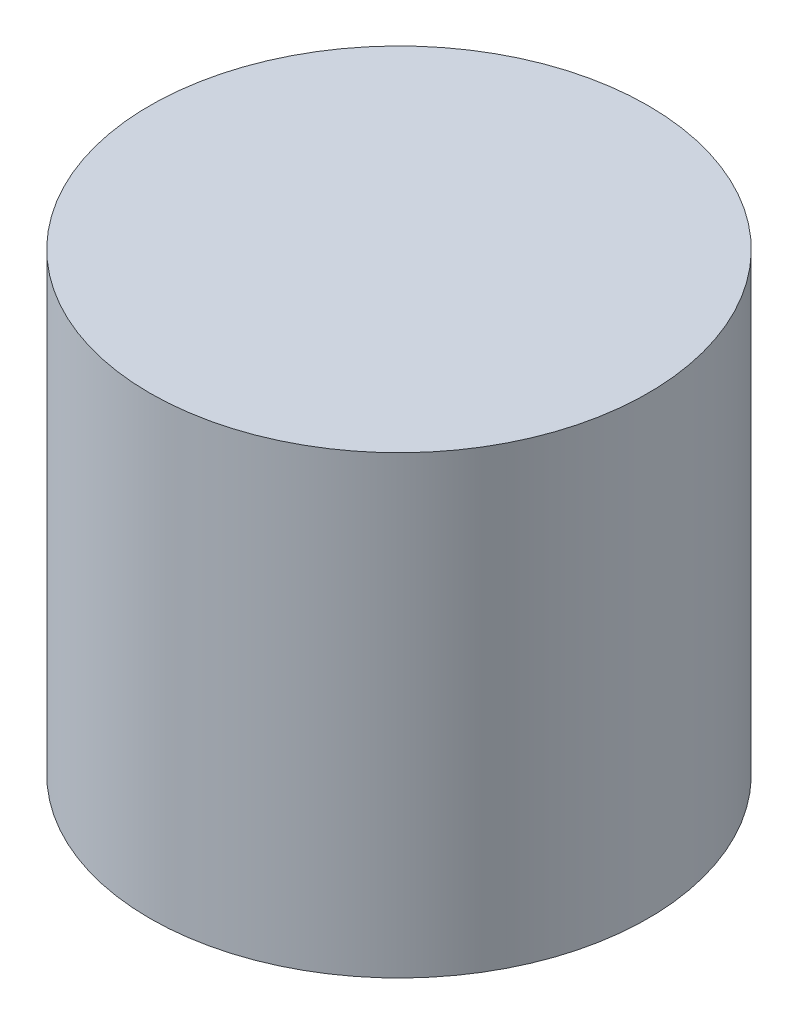
ISO-10303-21;
HEADER;
FILE_DESCRIPTION(('STEP AP214'),'2;1');
FILE_NAME('part.step','',(''),(''),'','','');
FILE_SCHEMA(('AUTOMOTIVE_DESIGN { 1 0 10303 214 1 1 1 1 }'));
ENDSEC;
DATA;
#1=APPLICATION_CONTEXT('core data for automotive mechanical design processes');
#2=APPLICATION_PROTOCOL_DEFINITION('international standard','automotive_design',2000,#1);
#3=PRODUCT_CONTEXT('',#1,'mechanical');
#4=PRODUCT('Part','Part','',(#3));
#5=PRODUCT_RELATED_PRODUCT_CATEGORY('part','',(#4));
#6=PRODUCT_DEFINITION_FORMATION('','',#4);
#7=PRODUCT_DEFINITION_CONTEXT('part definition',#1,'design');
#8=PRODUCT_DEFINITION('design','',#6,#7);
#9=PRODUCT_DEFINITION_SHAPE('','',#8);
#10=(LENGTH_UNIT() NAMED_UNIT(*) SI_UNIT(.MILLI.,.METRE.));
#11=(NAMED_UNIT(*) PLANE_ANGLE_UNIT() SI_UNIT($,.RADIAN.));
#12=(NAMED_UNIT(*) SI_UNIT($,.STERADIAN.) SOLID_ANGLE_UNIT());
#13=UNCERTAINTY_MEASURE_WITH_UNIT(LENGTH_MEASURE(1.E-05),#10,'distance_accuracy_value','');
#14=(GEOMETRIC_REPRESENTATION_CONTEXT(3) GLOBAL_UNCERTAINTY_ASSIGNED_CONTEXT((#13)) GLOBAL_UNIT_ASSIGNED_CONTEXT((#10,
#11,#12)) REPRESENTATION_CONTEXT('',''));
#15=CARTESIAN_POINT('',(0.,0.,0.));
#16=DIRECTION('',(0.,0.,1.));
#17=DIRECTION('',(1.,0.,0.));
#18=AXIS2_PLACEMENT_3D('',#15,#16,#17);
#19=CARTESIAN_POINT('',(0.,45.2,0.));
#20=DIRECTION('',(0.,-1.,0.));
#21=DIRECTION('',(0.,0.,-1.));
#22=AXIS2_PLACEMENT_3D('',#19,#20,#21);
#23=CYLINDRICAL_SURFACE('',#22,24.75);
#24=CARTESIAN_POINT('',(0.,45.2,0.));
#25=DIRECTION('',(0.,1.,0.));
#26=DIRECTION('',(0.,0.,1.));
#27=AXIS2_PLACEMENT_3D('',#24,#25,#26);
#28=CIRCLE('',#27,24.75);
#29=CARTESIAN_POINT('',(0.,45.2,24.75));
#30=VERTEX_POINT('',#29);
#31=EDGE_CURVE('E10',#30,#30,#28,.T.);
#32=ORIENTED_EDGE('',*,*,#31,.F.);
#33=EDGE_LOOP('',(#32));
#34=FACE_BOUND('',#33,.T.);
#35=CARTESIAN_POINT('',(0.,0.,0.));
#36=DIRECTION('',(0.,1.,0.));
#37=DIRECTION('',(0.,0.,1.));
#38=AXIS2_PLACEMENT_3D('',#35,#36,#37);
#39=CIRCLE('',#38,24.75);
#40=CARTESIAN_POINT('',(0.,0.,24.75));
#41=VERTEX_POINT('',#40);
#42=EDGE_CURVE('E35',#41,#41,#39,.T.);
#43=ORIENTED_EDGE('',*,*,#42,.T.);
#44=EDGE_LOOP('',(#43));
#45=FACE_BOUND('',#44,.T.);
#46=ADVANCED_FACE('F32',(#34,#45),#23,.T.);
#47=CARTESIAN_POINT('',(0.,45.2,0.));
#48=DIRECTION('',(0.,1.,0.));
#49=DIRECTION('',(0.,0.,1.));
#50=AXIS2_PLACEMENT_3D('',#47,#48,#49);
#51=PLANE('',#50);
#52=ORIENTED_EDGE('',*,*,#31,.T.);
#53=EDGE_LOOP('',(#52));
#54=FACE_BOUND('',#53,.T.);
#55=ADVANCED_FACE('F47',(#54),#51,.T.);
#56=CARTESIAN_POINT('',(0.,0.,0.));
#57=DIRECTION('',(0.,1.,0.));
#58=DIRECTION('',(0.,0.,1.));
#59=AXIS2_PLACEMENT_3D('',#56,#57,#58);
#60=PLANE('',#59);
#61=ORIENTED_EDGE('',*,*,#42,.F.);
#62=EDGE_LOOP('',(#61));
#63=FACE_BOUND('',#62,.T.);
#64=ADVANCED_FACE('F45',(#63),#60,.F.);
#65=CLOSED_SHELL('',(#46,#55,#64));
#66=MANIFOLD_SOLID_BREP('B2',#65);
#67=ADVANCED_BREP_SHAPE_REPRESENTATION('',(#18,#66),#14);
#68=SHAPE_DEFINITION_REPRESENTATION(#9,#67);
ENDSEC;
END-ISO-10303-21;
